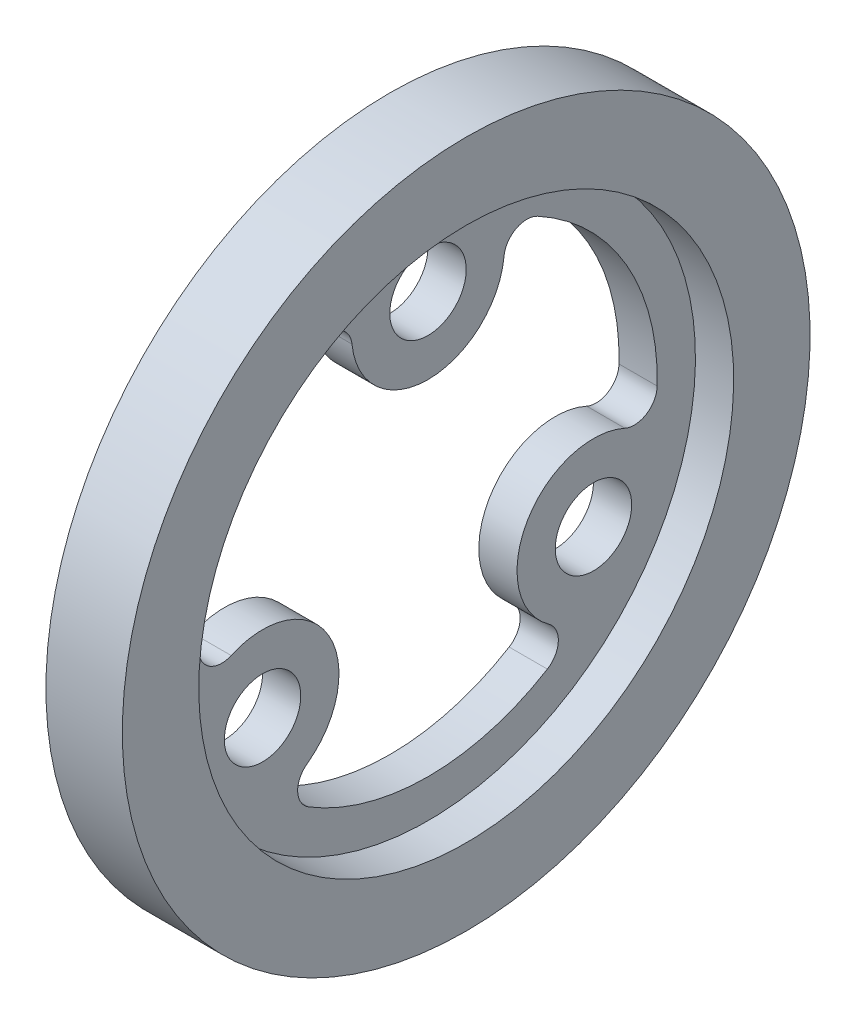
ISO-10303-21;
HEADER;
FILE_DESCRIPTION(('STEP AP214'),'2;1');
FILE_NAME('part.step','',(''),(''),'','','');
FILE_SCHEMA(('AUTOMOTIVE_DESIGN { 1 0 10303 214 1 1 1 1 }'));
ENDSEC;
DATA;
#1=APPLICATION_CONTEXT('core data for automotive mechanical design processes');
#2=APPLICATION_PROTOCOL_DEFINITION('international standard','automotive_design',2000,#1);
#3=PRODUCT_CONTEXT('',#1,'mechanical');
#4=PRODUCT('Part','Part','',(#3));
#5=PRODUCT_RELATED_PRODUCT_CATEGORY('part','',(#4));
#6=PRODUCT_DEFINITION_FORMATION('','',#4);
#7=PRODUCT_DEFINITION_CONTEXT('part definition',#1,'design');
#8=PRODUCT_DEFINITION('design','',#6,#7);
#9=PRODUCT_DEFINITION_SHAPE('','',#8);
#10=(LENGTH_UNIT() NAMED_UNIT(*) SI_UNIT(.MILLI.,.METRE.));
#11=(NAMED_UNIT(*) PLANE_ANGLE_UNIT() SI_UNIT($,.RADIAN.));
#12=(NAMED_UNIT(*) SI_UNIT($,.STERADIAN.) SOLID_ANGLE_UNIT());
#13=UNCERTAINTY_MEASURE_WITH_UNIT(LENGTH_MEASURE(1.E-05),#10,'distance_accuracy_value','');
#14=(GEOMETRIC_REPRESENTATION_CONTEXT(3) GLOBAL_UNCERTAINTY_ASSIGNED_CONTEXT((#13)) GLOBAL_UNIT_ASSIGNED_CONTEXT((#10,
#11,#12)) REPRESENTATION_CONTEXT('',''));
#15=CARTESIAN_POINT('',(0.,0.,0.));
#16=DIRECTION('',(0.,0.,1.));
#17=DIRECTION('',(1.,0.,0.));
#18=AXIS2_PLACEMENT_3D('',#15,#16,#17);
#19=CARTESIAN_POINT('',(0.,0.,0.));
#20=DIRECTION('',(1.,0.,0.));
#21=DIRECTION('',(0.,1.,0.));
#22=AXIS2_PLACEMENT_3D('',#19,#20,#21);
#23=PLANE('',#22);
#24=CARTESIAN_POINT('',(0.,25.,0.));
#25=DIRECTION('',(1.,0.,0.));
#26=DIRECTION('',(0.,1.,0.));
#27=AXIS2_PLACEMENT_3D('',#24,#25,#26);
#28=CIRCLE('',#27,5.);
#29=CARTESIAN_POINT('',(0.,30.,0.));
#30=VERTEX_POINT('',#29);
#31=EDGE_CURVE('E335',#30,#30,#28,.T.);
#32=ORIENTED_EDGE('',*,*,#31,.T.);
#33=EDGE_LOOP('',(#32));
#34=FACE_BOUND('',#33,.T.);
#35=CARTESIAN_POINT('',(0.,0.,0.));
#36=DIRECTION('',(-1.,0.,0.));
#37=DIRECTION('',(0.,-1.,0.));
#38=AXIS2_PLACEMENT_3D('',#35,#36,#37);
#39=CIRCLE('',#38,45.);
#40=CARTESIAN_POINT('',(0.,-45.,0.));
#41=VERTEX_POINT('',#40);
#42=EDGE_CURVE('E12',#41,#41,#39,.T.);
#43=ORIENTED_EDGE('',*,*,#42,.T.);
#44=EDGE_LOOP('',(#43));
#45=FACE_BOUND('',#44,.T.);
#46=CARTESIAN_POINT('',(0.,-12.5000000000032,21.6506350946092));
#47=DIRECTION('',(1.,0.,0.));
#48=DIRECTION('',(0.,1.,0.));
#49=AXIS2_PLACEMENT_3D('',#46,#47,#48);
#50=CIRCLE('',#49,5.00000000000372);
#51=CARTESIAN_POINT('',(0.,-7.49999999999952,21.6506350946092));
#52=VERTEX_POINT('',#51);
#53=EDGE_CURVE('E347',#52,#52,#50,.T.);
#54=ORIENTED_EDGE('',*,*,#53,.T.);
#55=EDGE_LOOP('',(#54));
#56=FACE_BOUND('',#55,.T.);
#57=CARTESIAN_POINT('',(0.,-12.5000000000001,-21.6506350946146));
#58=DIRECTION('',(1.,0.,0.));
#59=DIRECTION('',(0.,1.,0.));
#60=AXIS2_PLACEMENT_3D('',#57,#58,#59);
#61=CIRCLE('',#60,5.00000000000085);
#62=CARTESIAN_POINT('',(0.,-7.49999999999924,-21.6506350946146));
#63=VERTEX_POINT('',#62);
#64=EDGE_CURVE('E341',#63,#63,#61,.T.);
#65=ORIENTED_EDGE('',*,*,#64,.T.);
#66=EDGE_LOOP('',(#65));
#67=FACE_BOUND('',#66,.T.);
#68=CARTESIAN_POINT('',(0.,-12.5000000000032,21.6506350946092));
#69=DIRECTION('',(1.,0.,0.));
#70=DIRECTION('',(0.,1.,0.));
#71=AXIS2_PLACEMENT_3D('',#68,#69,#70);
#72=CIRCLE('',#71,10.);
#73=CARTESIAN_POINT('',(0.,-20.6168439698103,15.8096725052917));
#74=VERTEX_POINT('',#73);
#75=CARTESIAN_POINT('',(0.,-3.38315603019619,25.7595468763579));
#76=VERTEX_POINT('',#75);
#77=EDGE_CURVE('E239',#74,#76,#72,.T.);
#78=ORIENTED_EDGE('',*,*,#77,.F.);
#79=CARTESIAN_POINT('',(0.,-23.0518971607524,14.0573837284964));
#80=DIRECTION('',(1.,0.,0.));
#81=DIRECTION('',(0.,1.,0.));
#82=AXIS2_PLACEMENT_3D('',#79,#80,#81);
#83=CIRCLE('',#82,3.);
#84=CARTESIAN_POINT('',(0.,-25.6132190675025,15.6193152538848));
#85=VERTEX_POINT('',#84);
#86=EDGE_CURVE('E248',#74,#85,#83,.T.);
#87=ORIENTED_EDGE('',*,*,#86,.T.);
#88=CARTESIAN_POINT('',(0.,0.,0.));
#89=DIRECTION('',(1.,0.,0.));
#90=DIRECTION('',(0.,1.,0.));
#91=AXIS2_PLACEMENT_3D('',#88,#89,#90);
#92=CIRCLE('',#91,30.);
#93=CARTESIAN_POINT('',(0.,-25.6132190674973,-15.6193152538898));
#94=VERTEX_POINT('',#93);
#95=EDGE_CURVE('E164',#85,#94,#92,.T.);
#96=ORIENTED_EDGE('',*,*,#95,.T.);
#97=CARTESIAN_POINT('',(0.,-23.0518971607492,-14.0573837285018));
#98=DIRECTION('',(1.,0.,0.));
#99=DIRECTION('',(0.,1.,0.));
#100=AXIS2_PLACEMENT_3D('',#97,#98,#99);
#101=CIRCLE('',#100,3.);
#102=CARTESIAN_POINT('',(0.,-20.6168439698071,-15.8096725052971));
#103=VERTEX_POINT('',#102);
#104=EDGE_CURVE('E262',#94,#103,#101,.T.);
#105=ORIENTED_EDGE('',*,*,#104,.T.);
#106=CARTESIAN_POINT('',(0.,-12.5000000000001,-21.6506350946146));
#107=DIRECTION('',(1.,0.,0.));
#108=DIRECTION('',(0.,1.,0.));
#109=AXIS2_PLACEMENT_3D('',#106,#107,#108);
#110=CIRCLE('',#109,10.);
#111=CARTESIAN_POINT('',(0.,-3.38315603019305,-25.7595468763633));
#112=VERTEX_POINT('',#111);
#113=EDGE_CURVE('E265',#112,#103,#110,.T.);
#114=ORIENTED_EDGE('',*,*,#113,.F.);
#115=CARTESIAN_POINT('',(0.,-0.648102839250925,-26.9922204108879));
#116=DIRECTION('',(1.,0.,0.));
#117=DIRECTION('',(0.,1.,0.));
#118=AXIS2_PLACEMENT_3D('',#115,#116,#117);
#119=CIRCLE('',#118,3.00000000000001);
#120=CARTESIAN_POINT('',(0.,-0.720114265834263,-29.9913560120936));
#121=VERTEX_POINT('',#120);
#122=EDGE_CURVE('E267',#112,#121,#119,.T.);
#123=ORIENTED_EDGE('',*,*,#122,.T.);
#124=CARTESIAN_POINT('',(0.,0.,0.));
#125=DIRECTION('',(1.,0.,0.));
#126=DIRECTION('',(0.,1.,0.));
#127=AXIS2_PLACEMENT_3D('',#124,#125,#126);
#128=CIRCLE('',#127,30.);
#129=CARTESIAN_POINT('',(0.,26.3333333333333,-14.3720407582067));
#130=VERTEX_POINT('',#129);
#131=EDGE_CURVE('E270',#121,#130,#128,.T.);
#132=ORIENTED_EDGE('',*,*,#131,.T.);
#133=CARTESIAN_POINT('',(0.,23.7,-12.9348366823861));
#134=DIRECTION('',(1.,0.,0.));
#135=DIRECTION('',(0.,1.,0.));
#136=AXIS2_PLACEMENT_3D('',#133,#134,#135);
#137=CIRCLE('',#136,3.);
#138=CARTESIAN_POINT('',(0.,24.,-9.9498743710662));
#139=VERTEX_POINT('',#138);
#140=EDGE_CURVE('E273',#130,#139,#137,.T.);
#141=ORIENTED_EDGE('',*,*,#140,.T.);
#142=CARTESIAN_POINT('',(0.,25.,0.));
#143=DIRECTION('',(1.,0.,0.));
#144=DIRECTION('',(0.,1.,0.));
#145=AXIS2_PLACEMENT_3D('',#142,#143,#144);
#146=CIRCLE('',#145,10.);
#147=CARTESIAN_POINT('',(0.,24.,9.9498743710662));
#148=VERTEX_POINT('',#147);
#149=EDGE_CURVE('E276',#148,#139,#146,.T.);
#150=ORIENTED_EDGE('',*,*,#149,.F.);
#151=CARTESIAN_POINT('',(0.,23.7,12.9348366823861));
#152=DIRECTION('',(1.,0.,0.));
#153=DIRECTION('',(0.,1.,0.));
#154=AXIS2_PLACEMENT_3D('',#151,#152,#153);
#155=CIRCLE('',#154,3.);
#156=CARTESIAN_POINT('',(0.,26.3333333333333,14.3720407582067));
#157=VERTEX_POINT('',#156);
#158=EDGE_CURVE('E278',#148,#157,#155,.T.);
#159=ORIENTED_EDGE('',*,*,#158,.T.);
#160=CARTESIAN_POINT('',(0.,0.,0.));
#161=DIRECTION('',(1.,0.,0.));
#162=DIRECTION('',(0.,1.,0.));
#163=AXIS2_PLACEMENT_3D('',#160,#161,#162);
#164=CIRCLE('',#163,30.);
#165=CARTESIAN_POINT('',(0.,-0.720114265837918,29.9913560120935));
#166=VERTEX_POINT('',#165);
#167=EDGE_CURVE('E281',#157,#166,#164,.T.);
#168=ORIENTED_EDGE('',*,*,#167,.T.);
#169=CARTESIAN_POINT('',(0.,-0.648102839254086,26.9922204108825));
#170=DIRECTION('',(1.,0.,0.));
#171=DIRECTION('',(0.,1.,0.));
#172=AXIS2_PLACEMENT_3D('',#169,#170,#171);
#173=CIRCLE('',#172,3.);
#174=EDGE_CURVE('E245',#166,#76,#173,.T.);
#175=ORIENTED_EDGE('',*,*,#174,.T.);
#176=EDGE_LOOP('',(#78,#87,#96,#105,#114,#123,#132,#141,#150,#159,#168,#175));
#177=FACE_BOUND('',#176,.T.);
#178=ADVANCED_FACE('F150',(#34,#45,#56,#67,#177),#23,.F.);
#179=CARTESIAN_POINT('',(4.99999999999999,0.,0.));
#180=DIRECTION('',(1.,0.,0.));
#181=DIRECTION('',(0.,1.,0.));
#182=AXIS2_PLACEMENT_3D('',#179,#180,#181);
#183=PLANE('',#182);
#184=CARTESIAN_POINT('',(5.,25.,0.));
#185=DIRECTION('',(1.,0.,0.));
#186=DIRECTION('',(0.,1.,0.));
#187=AXIS2_PLACEMENT_3D('',#184,#185,#186);
#188=CIRCLE('',#187,5.);
#189=CARTESIAN_POINT('',(5.00000000000001,30.,0.));
#190=VERTEX_POINT('',#189);
#191=EDGE_CURVE('E315',#190,#190,#188,.T.);
#192=ORIENTED_EDGE('',*,*,#191,.F.);
#193=EDGE_LOOP('',(#192));
#194=FACE_BOUND('',#193,.T.);
#195=CARTESIAN_POINT('',(4.99999999999999,-12.5000000000001,-21.6506350946146));
#196=DIRECTION('',(1.,0.,0.));
#197=DIRECTION('',(0.,1.,0.));
#198=AXIS2_PLACEMENT_3D('',#195,#196,#197);
#199=CIRCLE('',#198,5.00000000000085);
#200=CARTESIAN_POINT('',(4.99999999999999,-7.49999999999924,-21.6506350946146));
#201=VERTEX_POINT('',#200);
#202=EDGE_CURVE('E338',#201,#201,#199,.T.);
#203=ORIENTED_EDGE('',*,*,#202,.F.);
#204=EDGE_LOOP('',(#203));
#205=FACE_BOUND('',#204,.T.);
#206=CARTESIAN_POINT('',(4.99999999999999,-12.5000000000032,21.6506350946092));
#207=DIRECTION('',(1.,0.,0.));
#208=DIRECTION('',(0.,1.,0.));
#209=AXIS2_PLACEMENT_3D('',#206,#207,#208);
#210=CIRCLE('',#209,5.00000000000372);
#211=CARTESIAN_POINT('',(4.99999999999999,-7.49999999999952,21.6506350946092));
#212=VERTEX_POINT('',#211);
#213=EDGE_CURVE('E344',#212,#212,#210,.T.);
#214=ORIENTED_EDGE('',*,*,#213,.F.);
#215=EDGE_LOOP('',(#214));
#216=FACE_BOUND('',#215,.T.);
#217=CARTESIAN_POINT('',(4.99999999999999,0.,0.));
#218=DIRECTION('',(1.,0.,0.));
#219=DIRECTION('',(0.,1.,0.));
#220=AXIS2_PLACEMENT_3D('',#217,#218,#219);
#221=CIRCLE('',#220,35.);
#222=CARTESIAN_POINT('',(5.00000000000001,35.,0.));
#223=VERTEX_POINT('',#222);
#224=EDGE_CURVE('E353',#223,#223,#221,.T.);
#225=ORIENTED_EDGE('',*,*,#224,.T.);
#226=EDGE_LOOP('',(#225));
#227=FACE_BOUND('',#226,.T.);
#228=CARTESIAN_POINT('',(4.99999999999998,-23.0518971607524,14.0573837284964));
#229=DIRECTION('',(1.,0.,0.));
#230=DIRECTION('',(0.,1.,0.));
#231=AXIS2_PLACEMENT_3D('',#228,#229,#230);
#232=CIRCLE('',#231,3.);
#233=CARTESIAN_POINT('',(4.99999999999998,-20.6168439698103,15.8096725052917));
#234=VERTEX_POINT('',#233);
#235=CARTESIAN_POINT('',(4.99999999999998,-25.6132190675009,15.6193152538838));
#236=VERTEX_POINT('',#235);
#237=EDGE_CURVE('E285',#234,#236,#232,.T.);
#238=ORIENTED_EDGE('',*,*,#237,.F.);
#239=CARTESIAN_POINT('',(4.99999999999999,-12.5000000000032,21.6506350946092));
#240=DIRECTION('',(1.,0.,0.));
#241=DIRECTION('',(0.,1.,0.));
#242=AXIS2_PLACEMENT_3D('',#239,#240,#241);
#243=CIRCLE('',#242,10.);
#244=CARTESIAN_POINT('',(4.99999999999999,-3.38315603019619,25.7595468763579));
#245=VERTEX_POINT('',#244);
#246=EDGE_CURVE('E172',#234,#245,#243,.T.);
#247=ORIENTED_EDGE('',*,*,#246,.T.);
#248=CARTESIAN_POINT('',(4.99999999999999,-0.648102839254088,26.9922204108825));
#249=DIRECTION('',(1.,0.,0.));
#250=DIRECTION('',(0.,1.,0.));
#251=AXIS2_PLACEMENT_3D('',#248,#249,#250);
#252=CIRCLE('',#251,3.);
#253=CARTESIAN_POINT('',(4.99999999999999,-0.72011426583792,29.9913560120935));
#254=VERTEX_POINT('',#253);
#255=EDGE_CURVE('E255',#254,#245,#252,.T.);
#256=ORIENTED_EDGE('',*,*,#255,.F.);
#257=CARTESIAN_POINT('',(4.99999999999999,0.,0.));
#258=DIRECTION('',(1.,0.,0.));
#259=DIRECTION('',(0.,1.,0.));
#260=AXIS2_PLACEMENT_3D('',#257,#258,#259);
#261=CIRCLE('',#260,30.);
#262=CARTESIAN_POINT('',(5.00000000000001,26.3333333333333,14.3720407582067));
#263=VERTEX_POINT('',#262);
#264=EDGE_CURVE('E258',#263,#254,#261,.T.);
#265=ORIENTED_EDGE('',*,*,#264,.F.);
#266=CARTESIAN_POINT('',(5.,23.7,12.9348366823861));
#267=DIRECTION('',(1.,0.,0.));
#268=DIRECTION('',(0.,1.,0.));
#269=AXIS2_PLACEMENT_3D('',#266,#267,#268);
#270=CIRCLE('',#269,3.);
#271=CARTESIAN_POINT('',(5.,24.,9.9498743710662));
#272=VERTEX_POINT('',#271);
#273=EDGE_CURVE('E308',#272,#263,#270,.T.);
#274=ORIENTED_EDGE('',*,*,#273,.F.);
#275=CARTESIAN_POINT('',(5.,25.,0.));
#276=DIRECTION('',(1.,0.,0.));
#277=DIRECTION('',(0.,1.,0.));
#278=AXIS2_PLACEMENT_3D('',#275,#276,#277);
#279=CIRCLE('',#278,10.);
#280=CARTESIAN_POINT('',(5.,24.,-9.9498743710662));
#281=VERTEX_POINT('',#280);
#282=EDGE_CURVE('E305',#272,#281,#279,.T.);
#283=ORIENTED_EDGE('',*,*,#282,.T.);
#284=CARTESIAN_POINT('',(5.,23.7,-12.9348366823861));
#285=DIRECTION('',(1.,0.,0.));
#286=DIRECTION('',(0.,1.,0.));
#287=AXIS2_PLACEMENT_3D('',#284,#285,#286);
#288=CIRCLE('',#287,3.);
#289=CARTESIAN_POINT('',(5.00000000000001,26.3333333333333,-14.3720407582067));
#290=VERTEX_POINT('',#289);
#291=EDGE_CURVE('E302',#290,#281,#288,.T.);
#292=ORIENTED_EDGE('',*,*,#291,.F.);
#293=CARTESIAN_POINT('',(4.99999999999999,0.,0.));
#294=DIRECTION('',(1.,0.,0.));
#295=DIRECTION('',(0.,1.,0.));
#296=AXIS2_PLACEMENT_3D('',#293,#294,#295);
#297=CIRCLE('',#296,30.);
#298=CARTESIAN_POINT('',(4.99999999999999,-0.720114265834265,-29.9913560120936));
#299=VERTEX_POINT('',#298);
#300=EDGE_CURVE('E299',#299,#290,#297,.T.);
#301=ORIENTED_EDGE('',*,*,#300,.F.);
#302=CARTESIAN_POINT('',(4.99999999999999,-0.648102839250927,-26.9922204108879));
#303=DIRECTION('',(1.,0.,0.));
#304=DIRECTION('',(0.,1.,0.));
#305=AXIS2_PLACEMENT_3D('',#302,#303,#304);
#306=CIRCLE('',#305,3.00000000000001);
#307=CARTESIAN_POINT('',(4.99999999999999,-3.38315603019305,-25.7595468763633));
#308=VERTEX_POINT('',#307);
#309=EDGE_CURVE('E296',#308,#299,#306,.T.);
#310=ORIENTED_EDGE('',*,*,#309,.F.);
#311=CARTESIAN_POINT('',(4.99999999999999,-12.5000000000001,-21.6506350946146));
#312=DIRECTION('',(1.,0.,0.));
#313=DIRECTION('',(0.,1.,0.));
#314=AXIS2_PLACEMENT_3D('',#311,#312,#313);
#315=CIRCLE('',#314,10.);
#316=CARTESIAN_POINT('',(4.99999999999998,-20.6168439698071,-15.8096725052971));
#317=VERTEX_POINT('',#316);
#318=EDGE_CURVE('E293',#308,#317,#315,.T.);
#319=ORIENTED_EDGE('',*,*,#318,.T.);
#320=CARTESIAN_POINT('',(4.99999999999998,-23.0518971607492,-14.0573837285018));
#321=DIRECTION('',(1.,0.,0.));
#322=DIRECTION('',(0.,1.,0.));
#323=AXIS2_PLACEMENT_3D('',#320,#321,#322);
#324=CIRCLE('',#323,3.);
#325=CARTESIAN_POINT('',(4.99999999999998,-25.6132190674973,-15.6193152538898));
#326=VERTEX_POINT('',#325);
#327=EDGE_CURVE('E290',#326,#317,#324,.T.);
#328=ORIENTED_EDGE('',*,*,#327,.F.);
#329=CARTESIAN_POINT('',(4.99999999999999,0.,0.));
#330=DIRECTION('',(1.,0.,0.));
#331=DIRECTION('',(0.,1.,0.));
#332=AXIS2_PLACEMENT_3D('',#329,#330,#331);
#333=CIRCLE('',#332,30.);
#334=EDGE_CURVE('E287',#236,#326,#333,.T.);
#335=ORIENTED_EDGE('',*,*,#334,.F.);
#336=EDGE_LOOP('',(#238,#247,#256,#265,#274,#283,#292,#301,#310,#319,#328,#335));
#337=FACE_BOUND('',#336,.T.);
#338=ADVANCED_FACE('F374',(#194,#205,#216,#227,#337),#183,.T.);
#339=CARTESIAN_POINT('',(0.,0.,0.));
#340=DIRECTION('',(-1.,0.,0.));
#341=DIRECTION('',(0.,-1.,0.));
#342=AXIS2_PLACEMENT_3D('',#339,#340,#341);
#343=CYLINDRICAL_SURFACE('',#342,45.);
#344=ORIENTED_EDGE('',*,*,#42,.F.);
#345=EDGE_LOOP('',(#344));
#346=FACE_BOUND('',#345,.T.);
#347=CARTESIAN_POINT('',(9.99999999999998,0.,0.));
#348=DIRECTION('',(-1.,0.,0.));
#349=DIRECTION('',(0.,-1.,0.));
#350=AXIS2_PLACEMENT_3D('',#347,#348,#349);
#351=CIRCLE('',#350,45.);
#352=CARTESIAN_POINT('',(9.99999999999996,-45.,0.));
#353=VERTEX_POINT('',#352);
#354=EDGE_CURVE('E157',#353,#353,#351,.T.);
#355=ORIENTED_EDGE('',*,*,#354,.T.);
#356=EDGE_LOOP('',(#355));
#357=FACE_BOUND('',#356,.T.);
#358=ADVANCED_FACE('F360',(#346,#357),#343,.T.);
#359=CARTESIAN_POINT('',(10.,45.,0.));
#360=DIRECTION('',(-1.,0.,0.));
#361=DIRECTION('',(0.,-1.,0.));
#362=AXIS2_PLACEMENT_3D('',#359,#360,#361);
#363=PLANE('',#362);
#364=CARTESIAN_POINT('',(9.99999999999999,0.,0.));
#365=DIRECTION('',(1.,0.,0.));
#366=DIRECTION('',(0.,1.,0.));
#367=AXIS2_PLACEMENT_3D('',#364,#365,#366);
#368=CIRCLE('',#367,35.);
#369=CARTESIAN_POINT('',(10.,35.,0.));
#370=VERTEX_POINT('',#369);
#371=EDGE_CURVE('E350',#370,#370,#368,.T.);
#372=ORIENTED_EDGE('',*,*,#371,.F.);
#373=EDGE_LOOP('',(#372));
#374=FACE_BOUND('',#373,.T.);
#375=ORIENTED_EDGE('',*,*,#354,.F.);
#376=EDGE_LOOP('',(#375));
#377=FACE_BOUND('',#376,.T.);
#378=ADVANCED_FACE('F362',(#374,#377),#363,.F.);
#379=CARTESIAN_POINT('',(4.99999999999999,0.,0.));
#380=DIRECTION('',(1.,0.,0.));
#381=DIRECTION('',(0.,1.,0.));
#382=AXIS2_PLACEMENT_3D('',#379,#380,#381);
#383=CYLINDRICAL_SURFACE('',#382,35.);
#384=ORIENTED_EDGE('',*,*,#224,.F.);
#385=EDGE_LOOP('',(#384));
#386=FACE_BOUND('',#385,.T.);
#387=ORIENTED_EDGE('',*,*,#371,.T.);
#388=EDGE_LOOP('',(#387));
#389=FACE_BOUND('',#388,.T.);
#390=ADVANCED_FACE('F364',(#386,#389),#383,.F.);
#391=CARTESIAN_POINT('',(0.,-12.5000000000032,21.6506350946092));
#392=DIRECTION('',(1.,0.,0.));
#393=DIRECTION('',(0.,1.,0.));
#394=AXIS2_PLACEMENT_3D('',#391,#392,#393);
#395=CYLINDRICAL_SURFACE('',#394,5.00000000000372);
#396=ORIENTED_EDGE('',*,*,#53,.F.);
#397=EDGE_LOOP('',(#396));
#398=FACE_BOUND('',#397,.T.);
#399=ORIENTED_EDGE('',*,*,#213,.T.);
#400=EDGE_LOOP('',(#399));
#401=FACE_BOUND('',#400,.T.);
#402=ADVANCED_FACE('F371',(#398,#401),#395,.F.);
#403=CARTESIAN_POINT('',(0.,-12.5000000000001,-21.6506350946146));
#404=DIRECTION('',(1.,0.,0.));
#405=DIRECTION('',(0.,1.,0.));
#406=AXIS2_PLACEMENT_3D('',#403,#404,#405);
#407=CYLINDRICAL_SURFACE('',#406,5.00000000000085);
#408=ORIENTED_EDGE('',*,*,#64,.F.);
#409=EDGE_LOOP('',(#408));
#410=FACE_BOUND('',#409,.T.);
#411=ORIENTED_EDGE('',*,*,#202,.T.);
#412=EDGE_LOOP('',(#411));
#413=FACE_BOUND('',#412,.T.);
#414=ADVANCED_FACE('F392',(#410,#413),#407,.F.);
#415=CARTESIAN_POINT('',(0.,-12.5000000000032,21.6506350946092));
#416=DIRECTION('',(1.,0.,0.));
#417=DIRECTION('',(0.,1.,0.));
#418=AXIS2_PLACEMENT_3D('',#415,#416,#417);
#419=CYLINDRICAL_SURFACE('',#418,10.);
#420=ORIENTED_EDGE('',*,*,#246,.F.);
#421=DIRECTION('',(1.,0.,0.));
#422=VECTOR('',#421,1.);
#423=CARTESIAN_POINT('',(0.,-20.6168439698103,15.8096725052917));
#424=LINE('',#423,#422);
#425=EDGE_CURVE('E235',#74,#234,#424,.T.);
#426=ORIENTED_EDGE('',*,*,#425,.F.);
#427=ORIENTED_EDGE('',*,*,#77,.T.);
#428=DIRECTION('',(1.,0.,0.));
#429=VECTOR('',#428,1.);
#430=CARTESIAN_POINT('',(0.,-3.38315603019619,25.7595468763579));
#431=LINE('',#430,#429);
#432=EDGE_CURVE('E313',#76,#245,#431,.T.);
#433=ORIENTED_EDGE('',*,*,#432,.T.);
#434=EDGE_LOOP('',(#420,#426,#427,#433));
#435=FACE_BOUND('',#434,.T.);
#436=ADVANCED_FACE('F237',(#435),#419,.T.);
#437=CARTESIAN_POINT('',(0.,-0.648102839254086,26.9922204108825));
#438=DIRECTION('',(1.,0.,0.));
#439=DIRECTION('',(0.,1.,0.));
#440=AXIS2_PLACEMENT_3D('',#437,#438,#439);
#441=CYLINDRICAL_SURFACE('',#440,3.);
#442=ORIENTED_EDGE('',*,*,#255,.T.);
#443=ORIENTED_EDGE('',*,*,#432,.F.);
#444=ORIENTED_EDGE('',*,*,#174,.F.);
#445=DIRECTION('',(1.,0.,0.));
#446=VECTOR('',#445,1.);
#447=CARTESIAN_POINT('',(0.,-0.720114265837918,29.9913560120935));
#448=LINE('',#447,#446);
#449=EDGE_CURVE('E316',#166,#254,#448,.T.);
#450=ORIENTED_EDGE('',*,*,#449,.T.);
#451=EDGE_LOOP('',(#442,#443,#444,#450));
#452=FACE_BOUND('',#451,.T.);
#453=ADVANCED_FACE('F441',(#452),#441,.F.);
#454=CARTESIAN_POINT('',(0.,0.,0.));
#455=DIRECTION('',(1.,0.,0.));
#456=DIRECTION('',(0.,1.,0.));
#457=AXIS2_PLACEMENT_3D('',#454,#455,#456);
#458=CYLINDRICAL_SURFACE('',#457,30.);
#459=ORIENTED_EDGE('',*,*,#264,.T.);
#460=ORIENTED_EDGE('',*,*,#449,.F.);
#461=ORIENTED_EDGE('',*,*,#167,.F.);
#462=DIRECTION('',(1.,0.,0.));
#463=VECTOR('',#462,1.);
#464=CARTESIAN_POINT('',(0.,26.3333333333333,14.3720407582067));
#465=LINE('',#464,#463);
#466=EDGE_CURVE('E318',#157,#263,#465,.T.);
#467=ORIENTED_EDGE('',*,*,#466,.T.);
#468=EDGE_LOOP('',(#459,#460,#461,#467));
#469=FACE_BOUND('',#468,.T.);
#470=ADVANCED_FACE('F438',(#469),#458,.F.);
#471=CARTESIAN_POINT('',(0.,23.7,12.9348366823861));
#472=DIRECTION('',(1.,0.,0.));
#473=DIRECTION('',(0.,1.,0.));
#474=AXIS2_PLACEMENT_3D('',#471,#472,#473);
#475=CYLINDRICAL_SURFACE('',#474,3.);
#476=ORIENTED_EDGE('',*,*,#273,.T.);
#477=ORIENTED_EDGE('',*,*,#466,.F.);
#478=ORIENTED_EDGE('',*,*,#158,.F.);
#479=DIRECTION('',(1.,0.,0.));
#480=VECTOR('',#479,1.);
#481=CARTESIAN_POINT('',(0.,24.,9.9498743710662));
#482=LINE('',#481,#480);
#483=EDGE_CURVE('E320',#148,#272,#482,.T.);
#484=ORIENTED_EDGE('',*,*,#483,.T.);
#485=EDGE_LOOP('',(#476,#477,#478,#484));
#486=FACE_BOUND('',#485,.T.);
#487=ADVANCED_FACE('F435',(#486),#475,.F.);
#488=CARTESIAN_POINT('',(0.,25.,0.));
#489=DIRECTION('',(1.,0.,0.));
#490=DIRECTION('',(0.,1.,0.));
#491=AXIS2_PLACEMENT_3D('',#488,#489,#490);
#492=CYLINDRICAL_SURFACE('',#491,10.);
#493=ORIENTED_EDGE('',*,*,#282,.F.);
#494=ORIENTED_EDGE('',*,*,#483,.F.);
#495=ORIENTED_EDGE('',*,*,#149,.T.);
#496=DIRECTION('',(1.,0.,0.));
#497=VECTOR('',#496,1.);
#498=CARTESIAN_POINT('',(0.,24.,-9.9498743710662));
#499=LINE('',#498,#497);
#500=EDGE_CURVE('E322',#139,#281,#499,.T.);
#501=ORIENTED_EDGE('',*,*,#500,.T.);
#502=EDGE_LOOP('',(#493,#494,#495,#501));
#503=FACE_BOUND('',#502,.T.);
#504=ADVANCED_FACE('F431',(#503),#492,.T.);
#505=CARTESIAN_POINT('',(0.,23.7,-12.9348366823861));
#506=DIRECTION('',(1.,0.,0.));
#507=DIRECTION('',(0.,1.,0.));
#508=AXIS2_PLACEMENT_3D('',#505,#506,#507);
#509=CYLINDRICAL_SURFACE('',#508,3.);
#510=ORIENTED_EDGE('',*,*,#291,.T.);
#511=ORIENTED_EDGE('',*,*,#500,.F.);
#512=ORIENTED_EDGE('',*,*,#140,.F.);
#513=DIRECTION('',(1.,0.,0.));
#514=VECTOR('',#513,1.);
#515=CARTESIAN_POINT('',(0.,26.3333333333333,-14.3720407582067));
#516=LINE('',#515,#514);
#517=EDGE_CURVE('E324',#130,#290,#516,.T.);
#518=ORIENTED_EDGE('',*,*,#517,.T.);
#519=EDGE_LOOP('',(#510,#511,#512,#518));
#520=FACE_BOUND('',#519,.T.);
#521=ADVANCED_FACE('F427',(#520),#509,.F.);
#522=CARTESIAN_POINT('',(0.,0.,0.));
#523=DIRECTION('',(1.,0.,0.));
#524=DIRECTION('',(0.,1.,0.));
#525=AXIS2_PLACEMENT_3D('',#522,#523,#524);
#526=CYLINDRICAL_SURFACE('',#525,30.);
#527=ORIENTED_EDGE('',*,*,#300,.T.);
#528=ORIENTED_EDGE('',*,*,#517,.F.);
#529=ORIENTED_EDGE('',*,*,#131,.F.);
#530=DIRECTION('',(1.,0.,0.));
#531=VECTOR('',#530,1.);
#532=CARTESIAN_POINT('',(0.,-0.720114265834263,-29.9913560120936));
#533=LINE('',#532,#531);
#534=EDGE_CURVE('E326',#121,#299,#533,.T.);
#535=ORIENTED_EDGE('',*,*,#534,.T.);
#536=EDGE_LOOP('',(#527,#528,#529,#535));
#537=FACE_BOUND('',#536,.T.);
#538=ADVANCED_FACE('F422',(#537),#526,.F.);
#539=CARTESIAN_POINT('',(0.,-0.648102839250925,-26.9922204108879));
#540=DIRECTION('',(1.,0.,0.));
#541=DIRECTION('',(0.,1.,0.));
#542=AXIS2_PLACEMENT_3D('',#539,#540,#541);
#543=CYLINDRICAL_SURFACE('',#542,3.00000000000001);
#544=ORIENTED_EDGE('',*,*,#309,.T.);
#545=ORIENTED_EDGE('',*,*,#534,.F.);
#546=ORIENTED_EDGE('',*,*,#122,.F.);
#547=DIRECTION('',(1.,0.,0.));
#548=VECTOR('',#547,1.);
#549=CARTESIAN_POINT('',(0.,-3.38315603019305,-25.7595468763633));
#550=LINE('',#549,#548);
#551=EDGE_CURVE('E328',#112,#308,#550,.T.);
#552=ORIENTED_EDGE('',*,*,#551,.T.);
#553=EDGE_LOOP('',(#544,#545,#546,#552));
#554=FACE_BOUND('',#553,.T.);
#555=ADVANCED_FACE('F418',(#554),#543,.F.);
#556=CARTESIAN_POINT('',(0.,-12.5000000000001,-21.6506350946146));
#557=DIRECTION('',(1.,0.,0.));
#558=DIRECTION('',(0.,1.,0.));
#559=AXIS2_PLACEMENT_3D('',#556,#557,#558);
#560=CYLINDRICAL_SURFACE('',#559,10.);
#561=ORIENTED_EDGE('',*,*,#318,.F.);
#562=ORIENTED_EDGE('',*,*,#551,.F.);
#563=ORIENTED_EDGE('',*,*,#113,.T.);
#564=DIRECTION('',(1.,0.,0.));
#565=VECTOR('',#564,1.);
#566=CARTESIAN_POINT('',(0.,-20.6168439698071,-15.8096725052971));
#567=LINE('',#566,#565);
#568=EDGE_CURVE('E330',#103,#317,#567,.T.);
#569=ORIENTED_EDGE('',*,*,#568,.T.);
#570=EDGE_LOOP('',(#561,#562,#563,#569));
#571=FACE_BOUND('',#570,.T.);
#572=ADVANCED_FACE('F415',(#571),#560,.T.);
#573=CARTESIAN_POINT('',(0.,-23.0518971607492,-14.0573837285018));
#574=DIRECTION('',(1.,0.,0.));
#575=DIRECTION('',(0.,1.,0.));
#576=AXIS2_PLACEMENT_3D('',#573,#574,#575);
#577=CYLINDRICAL_SURFACE('',#576,3.);
#578=ORIENTED_EDGE('',*,*,#327,.T.);
#579=ORIENTED_EDGE('',*,*,#568,.F.);
#580=ORIENTED_EDGE('',*,*,#104,.F.);
#581=DIRECTION('',(1.,0.,0.));
#582=VECTOR('',#581,1.);
#583=CARTESIAN_POINT('',(0.,-25.6132190674973,-15.6193152538898));
#584=LINE('',#583,#582);
#585=EDGE_CURVE('E332',#94,#326,#584,.T.);
#586=ORIENTED_EDGE('',*,*,#585,.T.);
#587=EDGE_LOOP('',(#578,#579,#580,#586));
#588=FACE_BOUND('',#587,.T.);
#589=ADVANCED_FACE('F410',(#588),#577,.F.);
#590=CARTESIAN_POINT('',(0.,0.,0.));
#591=DIRECTION('',(1.,0.,0.));
#592=DIRECTION('',(0.,1.,0.));
#593=AXIS2_PLACEMENT_3D('',#590,#591,#592);
#594=CYLINDRICAL_SURFACE('',#593,30.);
#595=ORIENTED_EDGE('',*,*,#334,.T.);
#596=ORIENTED_EDGE('',*,*,#585,.F.);
#597=ORIENTED_EDGE('',*,*,#95,.F.);
#598=DIRECTION('',(1.,0.,0.));
#599=VECTOR('',#598,1.);
#600=CARTESIAN_POINT('',(0.,-25.6132190675009,15.6193152538838));
#601=LINE('',#600,#599);
#602=EDGE_CURVE('E244',#85,#236,#601,.T.);
#603=ORIENTED_EDGE('',*,*,#602,.T.);
#604=EDGE_LOOP('',(#595,#596,#597,#603));
#605=FACE_BOUND('',#604,.T.);
#606=ADVANCED_FACE('F406',(#605),#594,.F.);
#607=CARTESIAN_POINT('',(0.,-23.0518971607524,14.0573837284964));
#608=DIRECTION('',(1.,0.,0.));
#609=DIRECTION('',(0.,1.,0.));
#610=AXIS2_PLACEMENT_3D('',#607,#608,#609);
#611=CYLINDRICAL_SURFACE('',#610,3.);
#612=ORIENTED_EDGE('',*,*,#237,.T.);
#613=ORIENTED_EDGE('',*,*,#602,.F.);
#614=ORIENTED_EDGE('',*,*,#86,.F.);
#615=ORIENTED_EDGE('',*,*,#425,.T.);
#616=EDGE_LOOP('',(#612,#613,#614,#615));
#617=FACE_BOUND('',#616,.T.);
#618=ADVANCED_FACE('F249',(#617),#611,.F.);
#619=CARTESIAN_POINT('',(0.,25.,0.));
#620=DIRECTION('',(1.,0.,0.));
#621=DIRECTION('',(0.,1.,0.));
#622=AXIS2_PLACEMENT_3D('',#619,#620,#621);
#623=CYLINDRICAL_SURFACE('',#622,5.);
#624=ORIENTED_EDGE('',*,*,#31,.F.);
#625=EDGE_LOOP('',(#624));
#626=FACE_BOUND('',#625,.T.);
#627=ORIENTED_EDGE('',*,*,#191,.T.);
#628=EDGE_LOOP('',(#627));
#629=FACE_BOUND('',#628,.T.);
#630=ADVANCED_FACE('F468',(#626,#629),#623,.F.);
#631=CLOSED_SHELL('',(#178,#338,#358,#378,#390,#402,#414,#436,#453,#470,#487,#504,#521,#538,
#555,#572,#589,#606,#618,#630));
#632=MANIFOLD_SOLID_BREP('B2',#631);
#633=ADVANCED_BREP_SHAPE_REPRESENTATION('',(#18,#632),#14);
#634=SHAPE_DEFINITION_REPRESENTATION(#9,#633);
ENDSEC;
END-ISO-10303-21;
